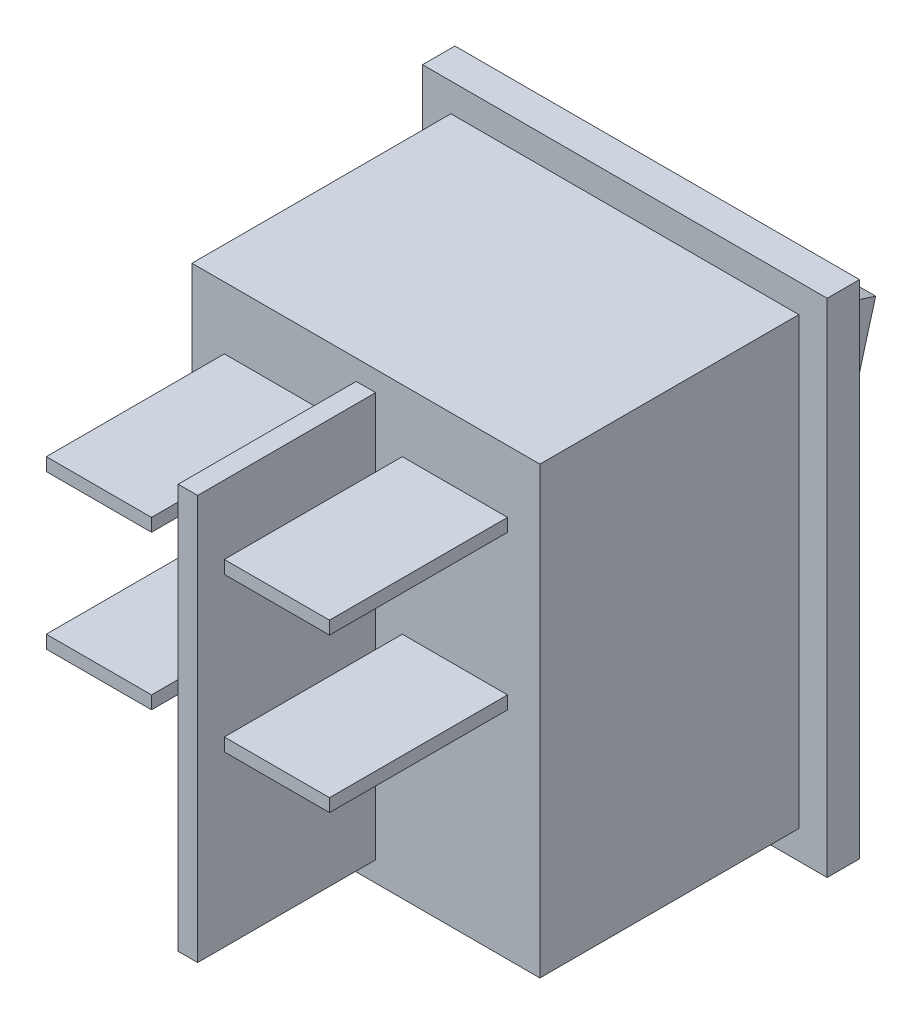
ISO-10303-21;
HEADER;
FILE_DESCRIPTION(('STEP AP214'),'2;1');
FILE_NAME('part.step','',(''),(''),'','','');
FILE_SCHEMA(('AUTOMOTIVE_DESIGN { 1 0 10303 214 1 1 1 1 }'));
ENDSEC;
DATA;
#1=APPLICATION_CONTEXT('core data for automotive mechanical design processes');
#2=APPLICATION_PROTOCOL_DEFINITION('international standard','automotive_design',2000,#1);
#3=PRODUCT_CONTEXT('',#1,'mechanical');
#4=PRODUCT('Part','Part','',(#3));
#5=PRODUCT_RELATED_PRODUCT_CATEGORY('part','',(#4));
#6=PRODUCT_DEFINITION_FORMATION('','',#4);
#7=PRODUCT_DEFINITION_CONTEXT('part definition',#1,'design');
#8=PRODUCT_DEFINITION('design','',#6,#7);
#9=PRODUCT_DEFINITION_SHAPE('','',#8);
#10=(LENGTH_UNIT() NAMED_UNIT(*) SI_UNIT(.MILLI.,.METRE.));
#11=(NAMED_UNIT(*) PLANE_ANGLE_UNIT() SI_UNIT($,.RADIAN.));
#12=(NAMED_UNIT(*) SI_UNIT($,.STERADIAN.) SOLID_ANGLE_UNIT());
#13=UNCERTAINTY_MEASURE_WITH_UNIT(LENGTH_MEASURE(1.E-05),#10,'distance_accuracy_value','');
#14=(GEOMETRIC_REPRESENTATION_CONTEXT(3) GLOBAL_UNCERTAINTY_ASSIGNED_CONTEXT((#13)) GLOBAL_UNIT_ASSIGNED_CONTEXT((#10,
#11,#12)) REPRESENTATION_CONTEXT('',''));
#15=CARTESIAN_POINT('',(0.,0.,0.));
#16=DIRECTION('',(0.,0.,1.));
#17=DIRECTION('',(1.,0.,0.));
#18=AXIS2_PLACEMENT_3D('',#15,#16,#17);
#19=CARTESIAN_POINT('',(-10.75,-13.75,29.));
#20=DIRECTION('',(1.,0.,0.));
#21=DIRECTION('',(0.,1.,0.));
#22=AXIS2_PLACEMENT_3D('',#19,#20,#21);
#23=PLANE('',#22);
#24=DIRECTION('',(0.,1.,0.));
#25=VECTOR('',#24,1.);
#26=CARTESIAN_POINT('',(-10.75,13.75,18.));
#27=LINE('',#26,#25);
#28=CARTESIAN_POINT('',(-10.75,-13.75,18.));
#29=VERTEX_POINT('',#28);
#30=CARTESIAN_POINT('',(-10.75,13.75,18.));
#31=VERTEX_POINT('',#30);
#32=EDGE_CURVE('E570',#29,#31,#27,.T.);
#33=ORIENTED_EDGE('',*,*,#32,.T.);
#34=DIRECTION('',(0.,0.,-1.));
#35=VECTOR('',#34,1.);
#36=CARTESIAN_POINT('',(-10.75,13.75,29.));
#37=LINE('',#36,#35);
#38=CARTESIAN_POINT('',(-10.75,13.75,2.));
#39=VERTEX_POINT('',#38);
#40=EDGE_CURVE('E486',#31,#39,#37,.T.);
#41=ORIENTED_EDGE('',*,*,#40,.T.);
#42=DIRECTION('',(0.,-1.,0.));
#43=VECTOR('',#42,1.);
#44=CARTESIAN_POINT('',(-10.75,-13.75,2.));
#45=LINE('',#44,#43);
#46=CARTESIAN_POINT('',(-10.75,-13.75,2.));
#47=VERTEX_POINT('',#46);
#48=EDGE_CURVE('E497',#39,#47,#45,.T.);
#49=ORIENTED_EDGE('',*,*,#48,.T.);
#50=DIRECTION('',(0.,0.,-1.));
#51=VECTOR('',#50,1.);
#52=CARTESIAN_POINT('',(-10.75,-13.75,29.));
#53=LINE('',#52,#51);
#54=EDGE_CURVE('E479',#29,#47,#53,.T.);
#55=ORIENTED_EDGE('',*,*,#54,.F.);
#56=EDGE_LOOP('',(#33,#41,#49,#55));
#57=FACE_BOUND('',#56,.T.);
#58=ADVANCED_FACE('F36',(#57),#23,.F.);
#59=CARTESIAN_POINT('',(10.75,-13.75,29.));
#60=DIRECTION('',(0.,1.,0.));
#61=DIRECTION('',(-1.,0.,0.));
#62=AXIS2_PLACEMENT_3D('',#59,#60,#61);
#63=PLANE('',#62);
#64=DIRECTION('',(-1.,0.,0.));
#65=VECTOR('',#64,1.);
#66=CARTESIAN_POINT('',(-10.75,-13.75,18.));
#67=LINE('',#66,#65);
#68=CARTESIAN_POINT('',(10.75,-13.75,18.));
#69=VERTEX_POINT('',#68);
#70=EDGE_CURVE('E573',#69,#29,#67,.T.);
#71=ORIENTED_EDGE('',*,*,#70,.T.);
#72=ORIENTED_EDGE('',*,*,#54,.T.);
#73=DIRECTION('',(1.,0.,0.));
#74=VECTOR('',#73,1.);
#75=CARTESIAN_POINT('',(10.75,-13.75,2.));
#76=LINE('',#75,#74);
#77=CARTESIAN_POINT('',(10.75,-13.75,2.));
#78=VERTEX_POINT('',#77);
#79=EDGE_CURVE('E494',#47,#78,#76,.T.);
#80=ORIENTED_EDGE('',*,*,#79,.T.);
#81=DIRECTION('',(0.,0.,-1.));
#82=VECTOR('',#81,1.);
#83=CARTESIAN_POINT('',(10.75,-13.75,29.));
#84=LINE('',#83,#82);
#85=EDGE_CURVE('E480',#69,#78,#84,.T.);
#86=ORIENTED_EDGE('',*,*,#85,.F.);
#87=EDGE_LOOP('',(#71,#72,#80,#86));
#88=FACE_BOUND('',#87,.T.);
#89=ADVANCED_FACE('F414',(#88),#63,.F.);
#90=CARTESIAN_POINT('',(10.75,13.75,29.));
#91=DIRECTION('',(-1.,0.,0.));
#92=DIRECTION('',(0.,-1.,0.));
#93=AXIS2_PLACEMENT_3D('',#90,#91,#92);
#94=PLANE('',#93);
#95=DIRECTION('',(0.,-1.,0.));
#96=VECTOR('',#95,1.);
#97=CARTESIAN_POINT('',(10.75,-13.75,18.));
#98=LINE('',#97,#96);
#99=CARTESIAN_POINT('',(10.75,13.75,18.));
#100=VERTEX_POINT('',#99);
#101=EDGE_CURVE('E51',#100,#69,#98,.T.);
#102=ORIENTED_EDGE('',*,*,#101,.T.);
#103=ORIENTED_EDGE('',*,*,#85,.T.);
#104=DIRECTION('',(0.,1.,0.));
#105=VECTOR('',#104,1.);
#106=CARTESIAN_POINT('',(10.75,13.75,2.));
#107=LINE('',#106,#105);
#108=CARTESIAN_POINT('',(10.75,13.75,2.));
#109=VERTEX_POINT('',#108);
#110=EDGE_CURVE('E491',#78,#109,#107,.T.);
#111=ORIENTED_EDGE('',*,*,#110,.T.);
#112=DIRECTION('',(0.,0.,-1.));
#113=VECTOR('',#112,1.);
#114=CARTESIAN_POINT('',(10.75,13.75,29.));
#115=LINE('',#114,#113);
#116=EDGE_CURVE('E484',#100,#109,#115,.T.);
#117=ORIENTED_EDGE('',*,*,#116,.F.);
#118=EDGE_LOOP('',(#102,#103,#111,#117));
#119=FACE_BOUND('',#118,.T.);
#120=ADVANCED_FACE('F410',(#119),#94,.F.);
#121=CARTESIAN_POINT('',(-10.75,13.75,29.));
#122=DIRECTION('',(0.,-1.,0.));
#123=DIRECTION('',(1.,0.,0.));
#124=AXIS2_PLACEMENT_3D('',#121,#122,#123);
#125=PLANE('',#124);
#126=DIRECTION('',(1.,0.,0.));
#127=VECTOR('',#126,1.);
#128=CARTESIAN_POINT('',(10.75,13.75,18.));
#129=LINE('',#128,#127);
#130=EDGE_CURVE('E551',#31,#100,#129,.T.);
#131=ORIENTED_EDGE('',*,*,#130,.T.);
#132=ORIENTED_EDGE('',*,*,#116,.T.);
#133=DIRECTION('',(-1.,0.,0.));
#134=VECTOR('',#133,1.);
#135=CARTESIAN_POINT('',(-10.75,13.75,2.));
#136=LINE('',#135,#134);
#137=EDGE_CURVE('E488',#109,#39,#136,.T.);
#138=ORIENTED_EDGE('',*,*,#137,.T.);
#139=ORIENTED_EDGE('',*,*,#40,.F.);
#140=EDGE_LOOP('',(#131,#132,#138,#139));
#141=FACE_BOUND('',#140,.T.);
#142=ADVANCED_FACE('F401',(#141),#125,.F.);
#143=CARTESIAN_POINT('',(9.5,12.,-4.));
#144=DIRECTION('',(-1.,0.,0.));
#145=DIRECTION('',(0.,-1.,0.));
#146=AXIS2_PLACEMENT_3D('',#143,#144,#145);
#147=PLANE('',#146);
#148=CARTESIAN_POINT('',(9.49999999999999,-12.,-0.395606649697375));
#149=CARTESIAN_POINT('',(9.49999999999999,-10.9388077344968,-0.407203251131328));
#150=CARTESIAN_POINT('',(9.49999999999999,-6.47035707461225,-0.456034026679239));
#151=CARTESIAN_POINT('',(9.49999999999999,1.36130253862841,-1.24450158928353));
#152=CARTESIAN_POINT('',(9.49999999999999,7.87953286006794,-3.08623094062161));
#153=CARTESIAN_POINT('',(9.49999999999999,11.1135352857263,-4.));
#154=B_SPLINE_CURVE_WITH_KNOTS('',3,(#148,#149,#150,#151,#152,#153),.UNSPECIFIED.,.F.,.F.,(4,1,
1,4),(0.,0.13563985663774,0.571150041893795,1.),.UNSPECIFIED.);
#155=CARTESIAN_POINT('',(9.5,11.1135352857263,-4.));
#156=VERTEX_POINT('',#155);
#157=CARTESIAN_POINT('',(9.49999999999999,-12.,-0.395606649697375));
#158=VERTEX_POINT('',#157);
#159=EDGE_CURVE('E516',#156,#158,#154,.F.);
#160=ORIENTED_EDGE('',*,*,#159,.F.);
#161=CARTESIAN_POINT('',(9.49999999999999,11.1135352857263,-4.));
#162=CARTESIAN_POINT('',(9.49999999999999,11.3839608449453,-3.18935338669517));
#163=CARTESIAN_POINT('',(9.49999999999999,11.8193065458659,-1.88433059562738));
#164=CARTESIAN_POINT('',(9.49999999999999,11.9503553460077,-0.517710732108176));
#165=CARTESIAN_POINT('',(9.49999999999999,12.,0.));
#166=B_SPLINE_CURVE_WITH_KNOTS('',3,(#161,#162,#163,#164,#165),.UNSPECIFIED.,.F.,.F.,(4,1,4),
(0.,0.621174295846243,1.),.UNSPECIFIED.);
#167=CARTESIAN_POINT('',(9.49999999999999,12.,0.));
#168=VERTEX_POINT('',#167);
#169=EDGE_CURVE('E529',#168,#156,#166,.F.);
#170=ORIENTED_EDGE('',*,*,#169,.F.);
#171=DIRECTION('',(0.,-1.,0.));
#172=VECTOR('',#171,1.);
#173=CARTESIAN_POINT('',(9.5,12.,0.));
#174=LINE('',#173,#172);
#175=CARTESIAN_POINT('',(9.49999999999999,-12.,0.));
#176=VERTEX_POINT('',#175);
#177=EDGE_CURVE('E513',#168,#176,#174,.T.);
#178=ORIENTED_EDGE('',*,*,#177,.T.);
#179=DIRECTION('',(0.,0.,1.));
#180=VECTOR('',#179,1.);
#181=CARTESIAN_POINT('',(9.49999999999999,-12.,-4.));
#182=LINE('',#181,#180);
#183=EDGE_CURVE('E500',#158,#176,#182,.T.);
#184=ORIENTED_EDGE('',*,*,#183,.F.);
#185=EDGE_LOOP('',(#160,#170,#178,#184));
#186=FACE_BOUND('',#185,.T.);
#187=ADVANCED_FACE('F397',(#186),#147,.F.);
#188=CARTESIAN_POINT('',(9.49999999999999,-12.,-4.));
#189=DIRECTION('',(0.,1.,0.));
#190=DIRECTION('',(-1.,0.,0.));
#191=AXIS2_PLACEMENT_3D('',#188,#189,#190);
#192=PLANE('',#191);
#193=DIRECTION('',(1.,0.,0.));
#194=VECTOR('',#193,1.);
#195=CARTESIAN_POINT('',(-77.9005027049288,-12.,-0.395606649697375));
#196=LINE('',#195,#194);
#197=CARTESIAN_POINT('',(-9.5,-12.,-0.395606649697375));
#198=VERTEX_POINT('',#197);
#199=EDGE_CURVE('E545',#198,#158,#196,.T.);
#200=ORIENTED_EDGE('',*,*,#199,.T.);
#201=ORIENTED_EDGE('',*,*,#183,.T.);
#202=DIRECTION('',(-1.,0.,0.));
#203=VECTOR('',#202,1.);
#204=CARTESIAN_POINT('',(9.49999999999999,-12.,0.));
#205=LINE('',#204,#203);
#206=CARTESIAN_POINT('',(-9.5,-12.,0.));
#207=VERTEX_POINT('',#206);
#208=EDGE_CURVE('E510',#176,#207,#205,.T.);
#209=ORIENTED_EDGE('',*,*,#208,.T.);
#210=DIRECTION('',(0.,0.,1.));
#211=VECTOR('',#210,1.);
#212=CARTESIAN_POINT('',(-9.5,-12.,-4.));
#213=LINE('',#212,#211);
#214=EDGE_CURVE('E502',#198,#207,#213,.T.);
#215=ORIENTED_EDGE('',*,*,#214,.F.);
#216=EDGE_LOOP('',(#200,#201,#209,#215));
#217=FACE_BOUND('',#216,.T.);
#218=ADVANCED_FACE('F393',(#217),#192,.F.);
#219=CARTESIAN_POINT('',(-9.5,12.,-4.));
#220=DIRECTION('',(1.,0.,0.));
#221=DIRECTION('',(0.,1.,0.));
#222=AXIS2_PLACEMENT_3D('',#219,#220,#221);
#223=PLANE('',#222);
#224=CARTESIAN_POINT('',(-9.49999999999999,-12.,-0.395606649697375));
#225=CARTESIAN_POINT('',(-9.49999999999999,-10.9388077344968,-0.407203251131328));
#226=CARTESIAN_POINT('',(-9.49999999999999,-6.47035707461225,-0.456034026679239));
#227=CARTESIAN_POINT('',(-9.49999999999999,1.36130253862842,-1.24450158928353));
#228=CARTESIAN_POINT('',(-9.49999999999999,7.87953286006794,-3.08623094062161));
#229=CARTESIAN_POINT('',(-9.49999999999999,11.1135352857263,-4.));
#230=B_SPLINE_CURVE_WITH_KNOTS('',3,(#224,#225,#226,#227,#228,#229),.UNSPECIFIED.,.F.,.F.,(4,1,
1,4),(0.,0.13563985663774,0.571150041893795,1.),.UNSPECIFIED.);
#231=CARTESIAN_POINT('',(-9.5,11.1135352857263,-4.));
#232=VERTEX_POINT('',#231);
#233=EDGE_CURVE('E521',#198,#232,#230,.T.);
#234=ORIENTED_EDGE('',*,*,#233,.F.);
#235=ORIENTED_EDGE('',*,*,#214,.T.);
#236=DIRECTION('',(0.,1.,0.));
#237=VECTOR('',#236,1.);
#238=CARTESIAN_POINT('',(-9.5,12.,0.));
#239=LINE('',#238,#237);
#240=CARTESIAN_POINT('',(-9.5,12.,0.));
#241=VERTEX_POINT('',#240);
#242=EDGE_CURVE('E507',#207,#241,#239,.T.);
#243=ORIENTED_EDGE('',*,*,#242,.T.);
#244=CARTESIAN_POINT('',(-9.49999999999999,11.1135352857263,-4.));
#245=CARTESIAN_POINT('',(-9.49999999999999,11.3839608449453,-3.18935338669517));
#246=CARTESIAN_POINT('',(-9.49999999999999,11.8193065458659,-1.88433059562738));
#247=CARTESIAN_POINT('',(-9.49999999999999,11.9503553460077,-0.517710732108176));
#248=CARTESIAN_POINT('',(-9.49999999999999,12.,0.));
#249=B_SPLINE_CURVE_WITH_KNOTS('',3,(#244,#245,#246,#247,#248),.UNSPECIFIED.,.F.,.F.,(4,1,4),
(0.,0.621174295846243,1.),.UNSPECIFIED.);
#250=EDGE_CURVE('E537',#232,#241,#249,.T.);
#251=ORIENTED_EDGE('',*,*,#250,.F.);
#252=EDGE_LOOP('',(#234,#235,#243,#251));
#253=FACE_BOUND('',#252,.T.);
#254=ADVANCED_FACE('F389',(#253),#223,.F.);
#255=CARTESIAN_POINT('',(-12.5,-15.5,0.));
#256=DIRECTION('',(0.,0.,1.));
#257=DIRECTION('',(1.,0.,0.));
#258=AXIS2_PLACEMENT_3D('',#255,#256,#257);
#259=PLANE('',#258);
#260=ORIENTED_EDGE('',*,*,#177,.F.);
#261=DIRECTION('',(1.,0.,0.));
#262=VECTOR('',#261,1.);
#263=CARTESIAN_POINT('',(9.5,12.,0.));
#264=LINE('',#263,#262);
#265=EDGE_CURVE('E504',#241,#168,#264,.T.);
#266=ORIENTED_EDGE('',*,*,#265,.F.);
#267=ORIENTED_EDGE('',*,*,#242,.F.);
#268=ORIENTED_EDGE('',*,*,#208,.F.);
#269=EDGE_LOOP('',(#260,#266,#267,#268));
#270=FACE_BOUND('',#269,.T.);
#271=DIRECTION('',(-1.,0.,0.));
#272=VECTOR('',#271,1.);
#273=CARTESIAN_POINT('',(-12.5,15.5,0.));
#274=LINE('',#273,#272);
#275=CARTESIAN_POINT('',(12.5,15.5,0.));
#276=VERTEX_POINT('',#275);
#277=CARTESIAN_POINT('',(-12.5,15.5,0.));
#278=VERTEX_POINT('',#277);
#279=EDGE_CURVE('E459',#276,#278,#274,.T.);
#280=ORIENTED_EDGE('',*,*,#279,.F.);
#281=DIRECTION('',(0.,1.,0.));
#282=VECTOR('',#281,1.);
#283=CARTESIAN_POINT('',(12.5,15.5,0.));
#284=LINE('',#283,#282);
#285=CARTESIAN_POINT('',(12.5,-15.5,0.));
#286=VERTEX_POINT('',#285);
#287=EDGE_CURVE('E451',#286,#276,#284,.T.);
#288=ORIENTED_EDGE('',*,*,#287,.F.);
#289=DIRECTION('',(1.,0.,0.));
#290=VECTOR('',#289,1.);
#291=CARTESIAN_POINT('',(12.5,-15.5,0.));
#292=LINE('',#291,#290);
#293=CARTESIAN_POINT('',(-12.5,-15.5,0.));
#294=VERTEX_POINT('',#293);
#295=EDGE_CURVE('E444',#294,#286,#292,.T.);
#296=ORIENTED_EDGE('',*,*,#295,.F.);
#297=DIRECTION('',(0.,-1.,0.));
#298=VECTOR('',#297,1.);
#299=CARTESIAN_POINT('',(-12.5,-15.5,0.));
#300=LINE('',#299,#298);
#301=EDGE_CURVE('E452',#278,#294,#300,.T.);
#302=ORIENTED_EDGE('',*,*,#301,.F.);
#303=EDGE_LOOP('',(#280,#288,#296,#302));
#304=FACE_BOUND('',#303,.T.);
#305=ADVANCED_FACE('F392',(#270,#304),#259,.F.);
#306=CARTESIAN_POINT('',(-12.5,-15.5,2.));
#307=DIRECTION('',(0.,0.,1.));
#308=DIRECTION('',(1.,0.,0.));
#309=AXIS2_PLACEMENT_3D('',#306,#307,#308);
#310=PLANE('',#309);
#311=DIRECTION('',(0.,-1.,0.));
#312=VECTOR('',#311,1.);
#313=CARTESIAN_POINT('',(-12.5,-15.5,2.));
#314=LINE('',#313,#312);
#315=CARTESIAN_POINT('',(-12.5,15.5,2.));
#316=VERTEX_POINT('',#315);
#317=CARTESIAN_POINT('',(-12.5,-15.5,2.));
#318=VERTEX_POINT('',#317);
#319=EDGE_CURVE('E461',#316,#318,#314,.T.);
#320=ORIENTED_EDGE('',*,*,#319,.T.);
#321=DIRECTION('',(1.,0.,0.));
#322=VECTOR('',#321,1.);
#323=CARTESIAN_POINT('',(12.5,-15.5,2.));
#324=LINE('',#323,#322);
#325=CARTESIAN_POINT('',(12.5,-15.5,2.));
#326=VERTEX_POINT('',#325);
#327=EDGE_CURVE('E467',#318,#326,#324,.T.);
#328=ORIENTED_EDGE('',*,*,#327,.T.);
#329=DIRECTION('',(0.,1.,0.));
#330=VECTOR('',#329,1.);
#331=CARTESIAN_POINT('',(12.5,15.5,2.));
#332=LINE('',#331,#330);
#333=CARTESIAN_POINT('',(12.5,15.5,2.));
#334=VERTEX_POINT('',#333);
#335=EDGE_CURVE('E456',#326,#334,#332,.T.);
#336=ORIENTED_EDGE('',*,*,#335,.T.);
#337=DIRECTION('',(-1.,0.,0.));
#338=VECTOR('',#337,1.);
#339=CARTESIAN_POINT('',(-12.5,15.5,2.));
#340=LINE('',#339,#338);
#341=EDGE_CURVE('E470',#334,#316,#340,.T.);
#342=ORIENTED_EDGE('',*,*,#341,.T.);
#343=EDGE_LOOP('',(#320,#328,#336,#342));
#344=FACE_BOUND('',#343,.T.);
#345=ORIENTED_EDGE('',*,*,#79,.F.);
#346=ORIENTED_EDGE('',*,*,#48,.F.);
#347=ORIENTED_EDGE('',*,*,#137,.F.);
#348=ORIENTED_EDGE('',*,*,#110,.F.);
#349=EDGE_LOOP('',(#345,#346,#347,#348));
#350=FACE_BOUND('',#349,.T.);
#351=ADVANCED_FACE('F424',(#344,#350),#310,.T.);
#352=CARTESIAN_POINT('',(-12.5,-15.5,2.));
#353=DIRECTION('',(1.,0.,0.));
#354=DIRECTION('',(0.,1.,0.));
#355=AXIS2_PLACEMENT_3D('',#352,#353,#354);
#356=PLANE('',#355);
#357=ORIENTED_EDGE('',*,*,#301,.T.);
#358=DIRECTION('',(0.,0.,-1.));
#359=VECTOR('',#358,1.);
#360=CARTESIAN_POINT('',(-12.5,-15.5,2.));
#361=LINE('',#360,#359);
#362=EDGE_CURVE('E13',#318,#294,#361,.T.);
#363=ORIENTED_EDGE('',*,*,#362,.F.);
#364=ORIENTED_EDGE('',*,*,#319,.F.);
#365=DIRECTION('',(0.,0.,-1.));
#366=VECTOR('',#365,1.);
#367=CARTESIAN_POINT('',(-12.5,15.5,2.));
#368=LINE('',#367,#366);
#369=EDGE_CURVE('E472',#316,#278,#368,.T.);
#370=ORIENTED_EDGE('',*,*,#369,.T.);
#371=EDGE_LOOP('',(#357,#363,#364,#370));
#372=FACE_BOUND('',#371,.T.);
#373=ADVANCED_FACE('F38',(#372),#356,.F.);
#374=CARTESIAN_POINT('',(12.5,-15.5,2.));
#375=DIRECTION('',(0.,1.,0.));
#376=DIRECTION('',(-1.,0.,0.));
#377=AXIS2_PLACEMENT_3D('',#374,#375,#376);
#378=PLANE('',#377);
#379=ORIENTED_EDGE('',*,*,#295,.T.);
#380=DIRECTION('',(0.,0.,-1.));
#381=VECTOR('',#380,1.);
#382=CARTESIAN_POINT('',(12.5,-15.5,2.));
#383=LINE('',#382,#381);
#384=EDGE_CURVE('E44',#326,#286,#383,.T.);
#385=ORIENTED_EDGE('',*,*,#384,.F.);
#386=ORIENTED_EDGE('',*,*,#327,.F.);
#387=ORIENTED_EDGE('',*,*,#362,.T.);
#388=EDGE_LOOP('',(#379,#385,#386,#387));
#389=FACE_BOUND('',#388,.T.);
#390=ADVANCED_FACE('F434',(#389),#378,.F.);
#391=CARTESIAN_POINT('',(12.5,15.5,2.));
#392=DIRECTION('',(-1.,0.,0.));
#393=DIRECTION('',(0.,-1.,0.));
#394=AXIS2_PLACEMENT_3D('',#391,#392,#393);
#395=PLANE('',#394);
#396=ORIENTED_EDGE('',*,*,#287,.T.);
#397=DIRECTION('',(0.,0.,-1.));
#398=VECTOR('',#397,1.);
#399=CARTESIAN_POINT('',(12.5,15.5,2.));
#400=LINE('',#399,#398);
#401=EDGE_CURVE('E457',#334,#276,#400,.T.);
#402=ORIENTED_EDGE('',*,*,#401,.F.);
#403=ORIENTED_EDGE('',*,*,#335,.F.);
#404=ORIENTED_EDGE('',*,*,#384,.T.);
#405=EDGE_LOOP('',(#396,#402,#403,#404));
#406=FACE_BOUND('',#405,.T.);
#407=ADVANCED_FACE('F431',(#406),#395,.F.);
#408=CARTESIAN_POINT('',(-12.5,15.5,2.));
#409=DIRECTION('',(0.,-1.,0.));
#410=DIRECTION('',(1.,0.,0.));
#411=AXIS2_PLACEMENT_3D('',#408,#409,#410);
#412=PLANE('',#411);
#413=ORIENTED_EDGE('',*,*,#279,.T.);
#414=ORIENTED_EDGE('',*,*,#369,.F.);
#415=ORIENTED_EDGE('',*,*,#341,.F.);
#416=ORIENTED_EDGE('',*,*,#401,.T.);
#417=EDGE_LOOP('',(#413,#414,#415,#416));
#418=FACE_BOUND('',#417,.T.);
#419=ADVANCED_FACE('F387',(#418),#412,.F.);
#420=CARTESIAN_POINT('',(-77.9005027049288,-12.,-0.395606649697375));
#421=CARTESIAN_POINT('',(-77.9005027049288,-10.9388077344967,-0.407203251131328));
#422=CARTESIAN_POINT('',(-77.9005027049288,-6.47035707461224,-0.456034026679239));
#423=CARTESIAN_POINT('',(-77.9005027049288,1.36130253862842,-1.24450158928353));
#424=CARTESIAN_POINT('',(-77.9005027049288,7.87953286006795,-3.08623094062161));
#425=CARTESIAN_POINT('',(-77.9005027049288,11.1135352857263,-4.));
#426=B_SPLINE_CURVE_WITH_KNOTS('',3,(#420,#421,#422,#423,#424,#425),.UNSPECIFIED.,.F.,.F.,(4,1,
1,4),(0.,0.13563985663774,0.571150041893795,1.),.UNSPECIFIED.);
#427=DIRECTION('',(1.,0.,0.));
#428=VECTOR('',#427,1.);
#429=SURFACE_OF_LINEAR_EXTRUSION('',#426,#428);
#430=DIRECTION('',(1.,0.,0.));
#431=VECTOR('',#430,1.);
#432=CARTESIAN_POINT('',(-77.9005027049288,11.1135352857263,-4.));
#433=LINE('',#432,#431);
#434=EDGE_CURVE('E546',#232,#156,#433,.T.);
#435=ORIENTED_EDGE('',*,*,#434,.T.);
#436=ORIENTED_EDGE('',*,*,#159,.T.);
#437=ORIENTED_EDGE('',*,*,#199,.F.);
#438=ORIENTED_EDGE('',*,*,#233,.T.);
#439=EDGE_LOOP('',(#435,#436,#437,#438));
#440=FACE_BOUND('',#439,.T.);
#441=ADVANCED_FACE('F381',(#440),#429,.T.);
#442=CARTESIAN_POINT('',(-77.9005027049288,11.1135352857263,-4.));
#443=CARTESIAN_POINT('',(-77.9005027049288,11.3839608449453,-3.18935338669517));
#444=CARTESIAN_POINT('',(-77.9005027049288,11.8193065458659,-1.88433059562738));
#445=CARTESIAN_POINT('',(-77.9005027049288,11.9503553460078,-0.517710732108176));
#446=CARTESIAN_POINT('',(-77.9005027049288,12.,0.));
#447=B_SPLINE_CURVE_WITH_KNOTS('',3,(#442,#443,#444,#445,#446),.UNSPECIFIED.,.F.,.F.,(4,1,4),
(0.,0.621174295846243,1.),.UNSPECIFIED.);
#448=DIRECTION('',(1.,0.,0.));
#449=VECTOR('',#448,1.);
#450=SURFACE_OF_LINEAR_EXTRUSION('',#447,#449);
#451=ORIENTED_EDGE('',*,*,#265,.T.);
#452=ORIENTED_EDGE('',*,*,#169,.T.);
#453=ORIENTED_EDGE('',*,*,#434,.F.);
#454=ORIENTED_EDGE('',*,*,#250,.T.);
#455=EDGE_LOOP('',(#451,#452,#453,#454));
#456=FACE_BOUND('',#455,.T.);
#457=ADVANCED_FACE('F376',(#456),#450,.T.);
#458=CARTESIAN_POINT('',(-0.600000000000008,-12.5,-32.9070193514141));
#459=DIRECTION('',(0.,-1.,0.));
#460=DIRECTION('',(0.,0.,-1.));
#461=AXIS2_PLACEMENT_3D('',#458,#459,#460);
#462=PLANE('',#461);
#463=DIRECTION('',(0.,0.,1.));
#464=VECTOR('',#463,1.);
#465=CARTESIAN_POINT('',(0.600000000000004,-12.5,-32.9070193514141));
#466=LINE('',#465,#464);
#467=CARTESIAN_POINT('',(0.600000000000004,-12.5,18.));
#468=VERTEX_POINT('',#467);
#469=CARTESIAN_POINT('',(0.600000000000004,-12.5,29.));
#470=VERTEX_POINT('',#469);
#471=EDGE_CURVE('E359',#468,#470,#466,.T.);
#472=ORIENTED_EDGE('',*,*,#471,.T.);
#473=DIRECTION('',(1.,0.,0.));
#474=VECTOR('',#473,1.);
#475=CARTESIAN_POINT('',(-0.600000000000008,-12.5,29.));
#476=LINE('',#475,#474);
#477=CARTESIAN_POINT('',(-0.600000000000008,-12.5,29.));
#478=VERTEX_POINT('',#477);
#479=EDGE_CURVE('E59',#478,#470,#476,.T.);
#480=ORIENTED_EDGE('',*,*,#479,.F.);
#481=DIRECTION('',(0.,0.,1.));
#482=VECTOR('',#481,1.);
#483=CARTESIAN_POINT('',(-0.600000000000008,-12.5,-32.9070193514141));
#484=LINE('',#483,#482);
#485=CARTESIAN_POINT('',(-0.600000000000008,-12.5,18.));
#486=VERTEX_POINT('',#485);
#487=EDGE_CURVE('E354',#486,#478,#484,.T.);
#488=ORIENTED_EDGE('',*,*,#487,.F.);
#489=DIRECTION('',(-1.,0.,0.));
#490=VECTOR('',#489,1.);
#491=CARTESIAN_POINT('',(-0.600000000000008,-12.5,18.));
#492=LINE('',#491,#490);
#493=EDGE_CURVE('E574',#468,#486,#492,.T.);
#494=ORIENTED_EDGE('',*,*,#493,.F.);
#495=EDGE_LOOP('',(#472,#480,#488,#494));
#496=FACE_BOUND('',#495,.T.);
#497=ADVANCED_FACE('F380',(#496),#462,.T.);
#498=CARTESIAN_POINT('',(0.6,12.5,-32.9070193514141));
#499=DIRECTION('',(1.,0.,0.));
#500=DIRECTION('',(0.,1.,0.));
#501=AXIS2_PLACEMENT_3D('',#498,#499,#500);
#502=PLANE('',#501);
#503=DIRECTION('',(0.,0.,1.));
#504=VECTOR('',#503,1.);
#505=CARTESIAN_POINT('',(0.6,12.5,-32.9070193514141));
#506=LINE('',#505,#504);
#507=CARTESIAN_POINT('',(0.6,12.5,18.));
#508=VERTEX_POINT('',#507);
#509=CARTESIAN_POINT('',(0.6,12.5,29.));
#510=VERTEX_POINT('',#509);
#511=EDGE_CURVE('E357',#508,#510,#506,.T.);
#512=ORIENTED_EDGE('',*,*,#511,.T.);
#513=DIRECTION('',(0.,1.,0.));
#514=VECTOR('',#513,1.);
#515=CARTESIAN_POINT('',(0.6,12.5,29.));
#516=LINE('',#515,#514);
#517=EDGE_CURVE('E348',#470,#510,#516,.T.);
#518=ORIENTED_EDGE('',*,*,#517,.F.);
#519=ORIENTED_EDGE('',*,*,#471,.F.);
#520=DIRECTION('',(0.,-1.,0.));
#521=VECTOR('',#520,1.);
#522=CARTESIAN_POINT('',(0.6,12.5,18.));
#523=LINE('',#522,#521);
#524=EDGE_CURVE('E559',#508,#468,#523,.T.);
#525=ORIENTED_EDGE('',*,*,#524,.F.);
#526=EDGE_LOOP('',(#512,#518,#519,#525));
#527=FACE_BOUND('',#526,.T.);
#528=ADVANCED_FACE('F634',(#527),#502,.T.);
#529=CARTESIAN_POINT('',(-0.599999999999998,12.5,-32.9070193514141));
#530=DIRECTION('',(0.,1.,0.));
#531=DIRECTION('',(0.,0.,1.));
#532=AXIS2_PLACEMENT_3D('',#529,#530,#531);
#533=PLANE('',#532);
#534=DIRECTION('',(0.,0.,1.));
#535=VECTOR('',#534,1.);
#536=CARTESIAN_POINT('',(-0.599999999999998,12.5,-32.9070193514141));
#537=LINE('',#536,#535);
#538=CARTESIAN_POINT('',(-0.599999999999998,12.5,18.));
#539=VERTEX_POINT('',#538);
#540=CARTESIAN_POINT('',(-0.599999999999998,12.5,29.));
#541=VERTEX_POINT('',#540);
#542=EDGE_CURVE('E355',#539,#541,#537,.T.);
#543=ORIENTED_EDGE('',*,*,#542,.T.);
#544=DIRECTION('',(-1.,0.,0.));
#545=VECTOR('',#544,1.);
#546=CARTESIAN_POINT('',(-0.599999999999998,12.5,29.));
#547=LINE('',#546,#545);
#548=EDGE_CURVE('E351',#510,#541,#547,.T.);
#549=ORIENTED_EDGE('',*,*,#548,.F.);
#550=ORIENTED_EDGE('',*,*,#511,.F.);
#551=DIRECTION('',(1.,0.,0.));
#552=VECTOR('',#551,1.);
#553=CARTESIAN_POINT('',(-0.599999999999998,12.5,18.));
#554=LINE('',#553,#552);
#555=EDGE_CURVE('E564',#539,#508,#554,.T.);
#556=ORIENTED_EDGE('',*,*,#555,.F.);
#557=EDGE_LOOP('',(#543,#549,#550,#556));
#558=FACE_BOUND('',#557,.T.);
#559=ADVANCED_FACE('F637',(#558),#533,.T.);
#560=CARTESIAN_POINT('',(-0.599999999999998,12.5,-32.9070193514141));
#561=DIRECTION('',(-1.,0.,0.));
#562=DIRECTION('',(0.,-1.,0.));
#563=AXIS2_PLACEMENT_3D('',#560,#561,#562);
#564=PLANE('',#563);
#565=ORIENTED_EDGE('',*,*,#487,.T.);
#566=DIRECTION('',(0.,-1.,0.));
#567=VECTOR('',#566,1.);
#568=CARTESIAN_POINT('',(-0.599999999999998,12.5,29.));
#569=LINE('',#568,#567);
#570=EDGE_CURVE('E338',#541,#478,#569,.T.);
#571=ORIENTED_EDGE('',*,*,#570,.F.);
#572=ORIENTED_EDGE('',*,*,#542,.F.);
#573=DIRECTION('',(0.,1.,0.));
#574=VECTOR('',#573,1.);
#575=CARTESIAN_POINT('',(-0.599999999999998,12.5,18.));
#576=LINE('',#575,#574);
#577=EDGE_CURVE('E568',#486,#539,#576,.T.);
#578=ORIENTED_EDGE('',*,*,#577,.F.);
#579=EDGE_LOOP('',(#565,#571,#572,#578));
#580=FACE_BOUND('',#579,.T.);
#581=ADVANCED_FACE('F383',(#580),#564,.T.);
#582=CARTESIAN_POINT('',(-8.75,9.1,-32.9070193514141));
#583=DIRECTION('',(0.,-1.,0.));
#584=DIRECTION('',(0.,0.,-1.));
#585=AXIS2_PLACEMENT_3D('',#582,#583,#584);
#586=PLANE('',#585);
#587=DIRECTION('',(0.,0.,1.));
#588=VECTOR('',#587,1.);
#589=CARTESIAN_POINT('',(-2.25,9.1,-32.9070193514141));
#590=LINE('',#589,#588);
#591=CARTESIAN_POINT('',(-2.25,9.1,18.));
#592=VERTEX_POINT('',#591);
#593=CARTESIAN_POINT('',(-2.25,9.1,29.));
#594=VERTEX_POINT('',#593);
#595=EDGE_CURVE('E341',#592,#594,#590,.T.);
#596=ORIENTED_EDGE('',*,*,#595,.T.);
#597=DIRECTION('',(1.,0.,0.));
#598=VECTOR('',#597,1.);
#599=CARTESIAN_POINT('',(-8.75,9.1,29.));
#600=LINE('',#599,#598);
#601=CARTESIAN_POINT('',(-8.75,9.1,29.));
#602=VERTEX_POINT('',#601);
#603=EDGE_CURVE('E326',#602,#594,#600,.T.);
#604=ORIENTED_EDGE('',*,*,#603,.F.);
#605=DIRECTION('',(0.,0.,1.));
#606=VECTOR('',#605,1.);
#607=CARTESIAN_POINT('',(-8.75,9.1,-32.9070193514141));
#608=LINE('',#607,#606);
#609=CARTESIAN_POINT('',(-8.75,9.1,18.));
#610=VERTEX_POINT('',#609);
#611=EDGE_CURVE('E335',#610,#602,#608,.T.);
#612=ORIENTED_EDGE('',*,*,#611,.F.);
#613=DIRECTION('',(-1.,0.,0.));
#614=VECTOR('',#613,1.);
#615=CARTESIAN_POINT('',(-8.75,9.1,18.));
#616=LINE('',#615,#614);
#617=EDGE_CURVE('E602',#592,#610,#616,.T.);
#618=ORIENTED_EDGE('',*,*,#617,.F.);
#619=EDGE_LOOP('',(#596,#604,#612,#618));
#620=FACE_BOUND('',#619,.T.);
#621=ADVANCED_FACE('F644',(#620),#586,.T.);
#622=CARTESIAN_POINT('',(-2.25,9.9,-32.9070193514141));
#623=DIRECTION('',(1.,0.,0.));
#624=DIRECTION('',(0.,0.,-1.));
#625=AXIS2_PLACEMENT_3D('',#622,#623,#624);
#626=PLANE('',#625);
#627=DIRECTION('',(0.,0.,1.));
#628=VECTOR('',#627,1.);
#629=CARTESIAN_POINT('',(-2.25,9.9,-32.9070193514141));
#630=LINE('',#629,#628);
#631=CARTESIAN_POINT('',(-2.25,9.9,18.));
#632=VERTEX_POINT('',#631);
#633=CARTESIAN_POINT('',(-2.25,9.9,29.));
#634=VERTEX_POINT('',#633);
#635=EDGE_CURVE('E339',#632,#634,#630,.T.);
#636=ORIENTED_EDGE('',*,*,#635,.T.);
#637=DIRECTION('',(0.,1.,0.));
#638=VECTOR('',#637,1.);
#639=CARTESIAN_POINT('',(-2.25,9.9,29.));
#640=LINE('',#639,#638);
#641=EDGE_CURVE('E329',#594,#634,#640,.T.);
#642=ORIENTED_EDGE('',*,*,#641,.F.);
#643=ORIENTED_EDGE('',*,*,#595,.F.);
#644=DIRECTION('',(0.,-1.,0.));
#645=VECTOR('',#644,1.);
#646=CARTESIAN_POINT('',(-2.25,9.9,18.));
#647=LINE('',#646,#645);
#648=EDGE_CURVE('E614',#632,#592,#647,.T.);
#649=ORIENTED_EDGE('',*,*,#648,.F.);
#650=EDGE_LOOP('',(#636,#642,#643,#649));
#651=FACE_BOUND('',#650,.T.);
#652=ADVANCED_FACE('F678',(#651),#626,.T.);
#653=CARTESIAN_POINT('',(-8.75,9.9,-32.9070193514141));
#654=DIRECTION('',(0.,1.,0.));
#655=DIRECTION('',(0.,0.,1.));
#656=AXIS2_PLACEMENT_3D('',#653,#654,#655);
#657=PLANE('',#656);
#658=DIRECTION('',(0.,0.,1.));
#659=VECTOR('',#658,1.);
#660=CARTESIAN_POINT('',(-8.75,9.9,-32.9070193514141));
#661=LINE('',#660,#659);
#662=CARTESIAN_POINT('',(-8.75,9.9,18.));
#663=VERTEX_POINT('',#662);
#664=CARTESIAN_POINT('',(-8.75,9.9,29.));
#665=VERTEX_POINT('',#664);
#666=EDGE_CURVE('E336',#663,#665,#661,.T.);
#667=ORIENTED_EDGE('',*,*,#666,.T.);
#668=DIRECTION('',(-1.,0.,0.));
#669=VECTOR('',#668,1.);
#670=CARTESIAN_POINT('',(-8.75,9.9,29.));
#671=LINE('',#670,#669);
#672=EDGE_CURVE('E332',#634,#665,#671,.T.);
#673=ORIENTED_EDGE('',*,*,#672,.F.);
#674=ORIENTED_EDGE('',*,*,#635,.F.);
#675=DIRECTION('',(1.,0.,0.));
#676=VECTOR('',#675,1.);
#677=CARTESIAN_POINT('',(-8.75,9.9,18.));
#678=LINE('',#677,#676);
#679=EDGE_CURVE('E617',#663,#632,#678,.T.);
#680=ORIENTED_EDGE('',*,*,#679,.F.);
#681=EDGE_LOOP('',(#667,#673,#674,#680));
#682=FACE_BOUND('',#681,.T.);
#683=ADVANCED_FACE('F687',(#682),#657,.T.);
#684=CARTESIAN_POINT('',(-8.75,9.9,-32.9070193514141));
#685=DIRECTION('',(-1.,0.,0.));
#686=DIRECTION('',(0.,0.,1.));
#687=AXIS2_PLACEMENT_3D('',#684,#685,#686);
#688=PLANE('',#687);
#689=ORIENTED_EDGE('',*,*,#611,.T.);
#690=DIRECTION('',(0.,-1.,0.));
#691=VECTOR('',#690,1.);
#692=CARTESIAN_POINT('',(-8.75,9.9,29.));
#693=LINE('',#692,#691);
#694=EDGE_CURVE('E317',#665,#602,#693,.T.);
#695=ORIENTED_EDGE('',*,*,#694,.F.);
#696=ORIENTED_EDGE('',*,*,#666,.F.);
#697=DIRECTION('',(0.,1.,0.));
#698=VECTOR('',#697,1.);
#699=CARTESIAN_POINT('',(-8.75,9.9,18.));
#700=LINE('',#699,#698);
#701=EDGE_CURVE('E606',#610,#663,#700,.T.);
#702=ORIENTED_EDGE('',*,*,#701,.F.);
#703=EDGE_LOOP('',(#689,#695,#696,#702));
#704=FACE_BOUND('',#703,.T.);
#705=ADVANCED_FACE('F647',(#704),#688,.T.);
#706=CARTESIAN_POINT('',(2.25,9.9,-32.9070193514141));
#707=DIRECTION('',(-1.,0.,0.));
#708=DIRECTION('',(0.,0.,1.));
#709=AXIS2_PLACEMENT_3D('',#706,#707,#708);
#710=PLANE('',#709);
#711=DIRECTION('',(0.,0.,1.));
#712=VECTOR('',#711,1.);
#713=CARTESIAN_POINT('',(2.25,9.1,-32.9070193514141));
#714=LINE('',#713,#712);
#715=CARTESIAN_POINT('',(2.25,9.1,18.));
#716=VERTEX_POINT('',#715);
#717=CARTESIAN_POINT('',(2.25,9.1,29.));
#718=VERTEX_POINT('',#717);
#719=EDGE_CURVE('E320',#716,#718,#714,.T.);
#720=ORIENTED_EDGE('',*,*,#719,.T.);
#721=DIRECTION('',(0.,-1.,0.));
#722=VECTOR('',#721,1.);
#723=CARTESIAN_POINT('',(2.25,9.9,29.));
#724=LINE('',#723,#722);
#725=CARTESIAN_POINT('',(2.25,9.9,29.));
#726=VERTEX_POINT('',#725);
#727=EDGE_CURVE('E305',#726,#718,#724,.T.);
#728=ORIENTED_EDGE('',*,*,#727,.F.);
#729=DIRECTION('',(0.,0.,1.));
#730=VECTOR('',#729,1.);
#731=CARTESIAN_POINT('',(2.25,9.9,-32.9070193514141));
#732=LINE('',#731,#730);
#733=CARTESIAN_POINT('',(2.25,9.9,18.));
#734=VERTEX_POINT('',#733);
#735=EDGE_CURVE('E314',#734,#726,#732,.T.);
#736=ORIENTED_EDGE('',*,*,#735,.F.);
#737=DIRECTION('',(0.,1.,0.));
#738=VECTOR('',#737,1.);
#739=CARTESIAN_POINT('',(2.25,9.9,18.));
#740=LINE('',#739,#738);
#741=EDGE_CURVE('E589',#716,#734,#740,.T.);
#742=ORIENTED_EDGE('',*,*,#741,.F.);
#743=EDGE_LOOP('',(#720,#728,#736,#742));
#744=FACE_BOUND('',#743,.T.);
#745=ADVANCED_FACE('F706',(#744),#710,.T.);
#746=CARTESIAN_POINT('',(8.75,9.1,-32.9070193514141));
#747=DIRECTION('',(0.,-1.,0.));
#748=DIRECTION('',(1.,0.,0.));
#749=AXIS2_PLACEMENT_3D('',#746,#747,#748);
#750=PLANE('',#749);
#751=DIRECTION('',(0.,0.,1.));
#752=VECTOR('',#751,1.);
#753=CARTESIAN_POINT('',(8.75,9.1,-32.9070193514141));
#754=LINE('',#753,#752);
#755=CARTESIAN_POINT('',(8.75,9.1,18.));
#756=VERTEX_POINT('',#755);
#757=CARTESIAN_POINT('',(8.75,9.1,29.));
#758=VERTEX_POINT('',#757);
#759=EDGE_CURVE('E318',#756,#758,#754,.T.);
#760=ORIENTED_EDGE('',*,*,#759,.T.);
#761=DIRECTION('',(1.,0.,0.));
#762=VECTOR('',#761,1.);
#763=CARTESIAN_POINT('',(8.75,9.1,29.));
#764=LINE('',#763,#762);
#765=EDGE_CURVE('E308',#718,#758,#764,.T.);
#766=ORIENTED_EDGE('',*,*,#765,.F.);
#767=ORIENTED_EDGE('',*,*,#719,.F.);
#768=DIRECTION('',(-1.,0.,0.));
#769=VECTOR('',#768,1.);
#770=CARTESIAN_POINT('',(8.75,9.1,18.));
#771=LINE('',#770,#769);
#772=EDGE_CURVE('E603',#756,#716,#771,.T.);
#773=ORIENTED_EDGE('',*,*,#772,.F.);
#774=EDGE_LOOP('',(#760,#766,#767,#773));
#775=FACE_BOUND('',#774,.T.);
#776=ADVANCED_FACE('F715',(#775),#750,.T.);
#777=CARTESIAN_POINT('',(8.75,9.9,-32.9070193514141));
#778=DIRECTION('',(1.,0.,0.));
#779=DIRECTION('',(0.,0.,-1.));
#780=AXIS2_PLACEMENT_3D('',#777,#778,#779);
#781=PLANE('',#780);
#782=DIRECTION('',(0.,0.,1.));
#783=VECTOR('',#782,1.);
#784=CARTESIAN_POINT('',(8.75,9.9,-32.9070193514141));
#785=LINE('',#784,#783);
#786=CARTESIAN_POINT('',(8.75,9.9,18.));
#787=VERTEX_POINT('',#786);
#788=CARTESIAN_POINT('',(8.75,9.9,29.));
#789=VERTEX_POINT('',#788);
#790=EDGE_CURVE('E315',#787,#789,#785,.T.);
#791=ORIENTED_EDGE('',*,*,#790,.T.);
#792=DIRECTION('',(0.,1.,0.));
#793=VECTOR('',#792,1.);
#794=CARTESIAN_POINT('',(8.75,9.9,29.));
#795=LINE('',#794,#793);
#796=EDGE_CURVE('E311',#758,#789,#795,.T.);
#797=ORIENTED_EDGE('',*,*,#796,.F.);
#798=ORIENTED_EDGE('',*,*,#759,.F.);
#799=DIRECTION('',(0.,-1.,0.));
#800=VECTOR('',#799,1.);
#801=CARTESIAN_POINT('',(8.75,9.9,18.));
#802=LINE('',#801,#800);
#803=EDGE_CURVE('E607',#787,#756,#802,.T.);
#804=ORIENTED_EDGE('',*,*,#803,.F.);
#805=EDGE_LOOP('',(#791,#797,#798,#804));
#806=FACE_BOUND('',#805,.T.);
#807=ADVANCED_FACE('F725',(#806),#781,.T.);
#808=CARTESIAN_POINT('',(8.75,9.9,-32.9070193514141));
#809=DIRECTION('',(0.,1.,0.));
#810=DIRECTION('',(-1.,0.,0.));
#811=AXIS2_PLACEMENT_3D('',#808,#809,#810);
#812=PLANE('',#811);
#813=ORIENTED_EDGE('',*,*,#735,.T.);
#814=DIRECTION('',(-1.,0.,0.));
#815=VECTOR('',#814,1.);
#816=CARTESIAN_POINT('',(8.75,9.9,29.));
#817=LINE('',#816,#815);
#818=EDGE_CURVE('E296',#789,#726,#817,.T.);
#819=ORIENTED_EDGE('',*,*,#818,.F.);
#820=ORIENTED_EDGE('',*,*,#790,.F.);
#821=DIRECTION('',(1.,0.,0.));
#822=VECTOR('',#821,1.);
#823=CARTESIAN_POINT('',(8.75,9.9,18.));
#824=LINE('',#823,#822);
#825=EDGE_CURVE('E593',#734,#787,#824,.T.);
#826=ORIENTED_EDGE('',*,*,#825,.F.);
#827=EDGE_LOOP('',(#813,#819,#820,#826));
#828=FACE_BOUND('',#827,.T.);
#829=ADVANCED_FACE('F735',(#828),#812,.T.);
#830=CARTESIAN_POINT('',(-8.7499999999999,-0.399999999999999,-32.9070193514141));
#831=DIRECTION('',(0.,-1.,0.));
#832=DIRECTION('',(0.,0.,-1.));
#833=AXIS2_PLACEMENT_3D('',#830,#831,#832);
#834=PLANE('',#833);
#835=DIRECTION('',(0.,0.,1.));
#836=VECTOR('',#835,1.);
#837=CARTESIAN_POINT('',(-2.2499999999999,-0.399999999999999,-32.9070193514141));
#838=LINE('',#837,#836);
#839=CARTESIAN_POINT('',(-2.2499999999999,-0.399999999999999,18.));
#840=VERTEX_POINT('',#839);
#841=CARTESIAN_POINT('',(-2.2499999999999,-0.399999999999999,29.));
#842=VERTEX_POINT('',#841);
#843=EDGE_CURVE('E299',#840,#842,#838,.T.);
#844=ORIENTED_EDGE('',*,*,#843,.T.);
#845=DIRECTION('',(1.,0.,0.));
#846=VECTOR('',#845,1.);
#847=CARTESIAN_POINT('',(-8.7499999999999,-0.399999999999999,29.));
#848=LINE('',#847,#846);
#849=CARTESIAN_POINT('',(-8.7499999999999,-0.399999999999999,29.));
#850=VERTEX_POINT('',#849);
#851=EDGE_CURVE('E284',#850,#842,#848,.T.);
#852=ORIENTED_EDGE('',*,*,#851,.F.);
#853=DIRECTION('',(0.,0.,1.));
#854=VECTOR('',#853,1.);
#855=CARTESIAN_POINT('',(-8.7499999999999,-0.399999999999999,-32.9070193514141));
#856=LINE('',#855,#854);
#857=CARTESIAN_POINT('',(-8.7499999999999,-0.399999999999999,18.));
#858=VERTEX_POINT('',#857);
#859=EDGE_CURVE('E293',#858,#850,#856,.T.);
#860=ORIENTED_EDGE('',*,*,#859,.F.);
#861=DIRECTION('',(-1.,0.,0.));
#862=VECTOR('',#861,1.);
#863=CARTESIAN_POINT('',(-8.7499999999999,-0.399999999999999,18.));
#864=LINE('',#863,#862);
#865=EDGE_CURVE('E363',#840,#858,#864,.T.);
#866=ORIENTED_EDGE('',*,*,#865,.F.);
#867=EDGE_LOOP('',(#844,#852,#860,#866));
#868=FACE_BOUND('',#867,.T.);
#869=ADVANCED_FACE('F745',(#868),#834,.T.);
#870=CARTESIAN_POINT('',(-2.2499999999999,0.399999999999999,-32.9070193514141));
#871=DIRECTION('',(1.,0.,0.));
#872=DIRECTION('',(0.,0.,-1.));
#873=AXIS2_PLACEMENT_3D('',#870,#871,#872);
#874=PLANE('',#873);
#875=DIRECTION('',(0.,0.,1.));
#876=VECTOR('',#875,1.);
#877=CARTESIAN_POINT('',(-2.2499999999999,0.399999999999999,-32.9070193514141));
#878=LINE('',#877,#876);
#879=CARTESIAN_POINT('',(-2.2499999999999,0.399999999999999,18.));
#880=VERTEX_POINT('',#879);
#881=CARTESIAN_POINT('',(-2.2499999999999,0.399999999999999,29.));
#882=VERTEX_POINT('',#881);
#883=EDGE_CURVE('E297',#880,#882,#878,.T.);
#884=ORIENTED_EDGE('',*,*,#883,.T.);
#885=DIRECTION('',(0.,1.,0.));
#886=VECTOR('',#885,1.);
#887=CARTESIAN_POINT('',(-2.2499999999999,0.399999999999999,29.));
#888=LINE('',#887,#886);
#889=EDGE_CURVE('E287',#842,#882,#888,.T.);
#890=ORIENTED_EDGE('',*,*,#889,.F.);
#891=ORIENTED_EDGE('',*,*,#843,.F.);
#892=DIRECTION('',(0.,-1.,0.));
#893=VECTOR('',#892,1.);
#894=CARTESIAN_POINT('',(-2.2499999999999,0.399999999999999,18.));
#895=LINE('',#894,#893);
#896=EDGE_CURVE('E590',#880,#840,#895,.T.);
#897=ORIENTED_EDGE('',*,*,#896,.F.);
#898=EDGE_LOOP('',(#884,#890,#891,#897));
#899=FACE_BOUND('',#898,.T.);
#900=ADVANCED_FACE('F755',(#899),#874,.T.);
#901=CARTESIAN_POINT('',(-8.7499999999999,0.399999999999999,-32.9070193514141));
#902=DIRECTION('',(0.,1.,0.));
#903=DIRECTION('',(0.,0.,1.));
#904=AXIS2_PLACEMENT_3D('',#901,#902,#903);
#905=PLANE('',#904);
#906=DIRECTION('',(0.,0.,1.));
#907=VECTOR('',#906,1.);
#908=CARTESIAN_POINT('',(-8.7499999999999,0.399999999999999,-32.9070193514141));
#909=LINE('',#908,#907);
#910=CARTESIAN_POINT('',(-8.7499999999999,0.399999999999999,18.));
#911=VERTEX_POINT('',#910);
#912=CARTESIAN_POINT('',(-8.7499999999999,0.399999999999999,29.));
#913=VERTEX_POINT('',#912);
#914=EDGE_CURVE('E294',#911,#913,#909,.T.);
#915=ORIENTED_EDGE('',*,*,#914,.T.);
#916=DIRECTION('',(-1.,0.,0.));
#917=VECTOR('',#916,1.);
#918=CARTESIAN_POINT('',(-8.7499999999999,0.399999999999999,29.));
#919=LINE('',#918,#917);
#920=EDGE_CURVE('E290',#882,#913,#919,.T.);
#921=ORIENTED_EDGE('',*,*,#920,.F.);
#922=ORIENTED_EDGE('',*,*,#883,.F.);
#923=DIRECTION('',(1.,0.,0.));
#924=VECTOR('',#923,1.);
#925=CARTESIAN_POINT('',(-8.7499999999999,0.399999999999999,18.));
#926=LINE('',#925,#924);
#927=EDGE_CURVE('E594',#911,#880,#926,.T.);
#928=ORIENTED_EDGE('',*,*,#927,.F.);
#929=EDGE_LOOP('',(#915,#921,#922,#928));
#930=FACE_BOUND('',#929,.T.);
#931=ADVANCED_FACE('F765',(#930),#905,.T.);
#932=CARTESIAN_POINT('',(-8.7499999999999,0.399999999999999,-32.9070193514141));
#933=DIRECTION('',(-1.,0.,0.));
#934=DIRECTION('',(0.,0.,1.));
#935=AXIS2_PLACEMENT_3D('',#932,#933,#934);
#936=PLANE('',#935);
#937=ORIENTED_EDGE('',*,*,#859,.T.);
#938=DIRECTION('',(0.,-1.,0.));
#939=VECTOR('',#938,1.);
#940=CARTESIAN_POINT('',(-8.7499999999999,0.399999999999999,29.));
#941=LINE('',#940,#939);
#942=EDGE_CURVE('E279',#913,#850,#941,.T.);
#943=ORIENTED_EDGE('',*,*,#942,.F.);
#944=ORIENTED_EDGE('',*,*,#914,.F.);
#945=DIRECTION('',(0.,1.,0.));
#946=VECTOR('',#945,1.);
#947=CARTESIAN_POINT('',(-8.7499999999999,0.399999999999999,18.));
#948=LINE('',#947,#946);
#949=EDGE_CURVE('E597',#858,#911,#948,.T.);
#950=ORIENTED_EDGE('',*,*,#949,.F.);
#951=EDGE_LOOP('',(#937,#943,#944,#950));
#952=FACE_BOUND('',#951,.T.);
#953=ADVANCED_FACE('F775',(#952),#936,.T.);
#954=CARTESIAN_POINT('',(2.2500000000001,0.399999999999999,-32.9070193514141));
#955=DIRECTION('',(-1.,0.,0.));
#956=DIRECTION('',(0.,0.,1.));
#957=AXIS2_PLACEMENT_3D('',#954,#955,#956);
#958=PLANE('',#957);
#959=DIRECTION('',(0.,0.,1.));
#960=VECTOR('',#959,1.);
#961=CARTESIAN_POINT('',(2.2500000000001,-0.399999999999999,-32.9070193514141));
#962=LINE('',#961,#960);
#963=CARTESIAN_POINT('',(2.2500000000001,-0.399999999999999,18.));
#964=VERTEX_POINT('',#963);
#965=CARTESIAN_POINT('',(2.2500000000001,-0.399999999999999,29.));
#966=VERTEX_POINT('',#965);
#967=EDGE_CURVE('E245',#964,#966,#962,.T.);
#968=ORIENTED_EDGE('',*,*,#967,.T.);
#969=DIRECTION('',(0.,-1.,0.));
#970=VECTOR('',#969,1.);
#971=CARTESIAN_POINT('',(2.2500000000001,0.399999999999999,29.));
#972=LINE('',#971,#970);
#973=CARTESIAN_POINT('',(2.2500000000001,0.399999999999999,29.));
#974=VERTEX_POINT('',#973);
#975=EDGE_CURVE('E250',#974,#966,#972,.T.);
#976=ORIENTED_EDGE('',*,*,#975,.F.);
#977=DIRECTION('',(0.,0.,1.));
#978=VECTOR('',#977,1.);
#979=CARTESIAN_POINT('',(2.2500000000001,0.399999999999999,-32.9070193514141));
#980=LINE('',#979,#978);
#981=CARTESIAN_POINT('',(2.2500000000001,0.399999999999999,18.));
#982=VERTEX_POINT('',#981);
#983=EDGE_CURVE('E257',#982,#974,#980,.T.);
#984=ORIENTED_EDGE('',*,*,#983,.F.);
#985=DIRECTION('',(0.,1.,0.));
#986=VECTOR('',#985,1.);
#987=CARTESIAN_POINT('',(2.2500000000001,0.399999999999999,18.));
#988=LINE('',#987,#986);
#989=EDGE_CURVE('E253',#964,#982,#988,.T.);
#990=ORIENTED_EDGE('',*,*,#989,.F.);
#991=EDGE_LOOP('',(#968,#976,#984,#990));
#992=FACE_BOUND('',#991,.T.);
#993=ADVANCED_FACE('F247',(#992),#958,.T.);
#994=CARTESIAN_POINT('',(8.7500000000001,-0.399999999999998,-32.9070193514141));
#995=DIRECTION('',(0.,-1.,0.));
#996=DIRECTION('',(1.,0.,0.));
#997=AXIS2_PLACEMENT_3D('',#994,#995,#996);
#998=PLANE('',#997);
#999=DIRECTION('',(0.,0.,1.));
#1000=VECTOR('',#999,1.);
#1001=CARTESIAN_POINT('',(8.7500000000001,-0.399999999999998,-32.9070193514141));
#1002=LINE('',#1001,#1000);
#1003=CARTESIAN_POINT('',(8.7500000000001,-0.399999999999998,18.));
#1004=VERTEX_POINT('',#1003);
#1005=CARTESIAN_POINT('',(8.7500000000001,-0.399999999999998,29.));
#1006=VERTEX_POINT('',#1005);
#1007=EDGE_CURVE('E256',#1004,#1006,#1002,.T.);
#1008=ORIENTED_EDGE('',*,*,#1007,.T.);
#1009=DIRECTION('',(1.,0.,0.));
#1010=VECTOR('',#1009,1.);
#1011=CARTESIAN_POINT('',(8.7500000000001,-0.399999999999998,29.));
#1012=LINE('',#1011,#1010);
#1013=EDGE_CURVE('E260',#966,#1006,#1012,.T.);
#1014=ORIENTED_EDGE('',*,*,#1013,.F.);
#1015=ORIENTED_EDGE('',*,*,#967,.F.);
#1016=DIRECTION('',(-1.,0.,0.));
#1017=VECTOR('',#1016,1.);
#1018=CARTESIAN_POINT('',(8.7500000000001,-0.399999999999998,18.));
#1019=LINE('',#1018,#1017);
#1020=EDGE_CURVE('E583',#1004,#964,#1019,.T.);
#1021=ORIENTED_EDGE('',*,*,#1020,.F.);
#1022=EDGE_LOOP('',(#1008,#1014,#1015,#1021));
#1023=FACE_BOUND('',#1022,.T.);
#1024=ADVANCED_FACE('F261',(#1023),#998,.T.);
#1025=CARTESIAN_POINT('',(8.7500000000001,0.399999999999998,-32.9070193514141));
#1026=DIRECTION('',(1.,0.,0.));
#1027=DIRECTION('',(0.,0.,-1.));
#1028=AXIS2_PLACEMENT_3D('',#1025,#1026,#1027);
#1029=PLANE('',#1028);
#1030=DIRECTION('',(0.,0.,1.));
#1031=VECTOR('',#1030,1.);
#1032=CARTESIAN_POINT('',(8.7500000000001,0.399999999999998,-32.9070193514141));
#1033=LINE('',#1032,#1031);
#1034=CARTESIAN_POINT('',(8.7500000000001,0.399999999999998,18.));
#1035=VERTEX_POINT('',#1034);
#1036=CARTESIAN_POINT('',(8.7500000000001,0.399999999999998,29.));
#1037=VERTEX_POINT('',#1036);
#1038=EDGE_CURVE('E277',#1035,#1037,#1033,.T.);
#1039=ORIENTED_EDGE('',*,*,#1038,.T.);
#1040=DIRECTION('',(0.,1.,0.));
#1041=VECTOR('',#1040,1.);
#1042=CARTESIAN_POINT('',(8.7500000000001,0.399999999999998,29.));
#1043=LINE('',#1042,#1041);
#1044=EDGE_CURVE('E266',#1006,#1037,#1043,.T.);
#1045=ORIENTED_EDGE('',*,*,#1044,.F.);
#1046=ORIENTED_EDGE('',*,*,#1007,.F.);
#1047=DIRECTION('',(0.,-1.,0.));
#1048=VECTOR('',#1047,1.);
#1049=CARTESIAN_POINT('',(8.7500000000001,0.399999999999998,18.));
#1050=LINE('',#1049,#1048);
#1051=EDGE_CURVE('E579',#1035,#1004,#1050,.T.);
#1052=ORIENTED_EDGE('',*,*,#1051,.F.);
#1053=EDGE_LOOP('',(#1039,#1045,#1046,#1052));
#1054=FACE_BOUND('',#1053,.T.);
#1055=ADVANCED_FACE('F802',(#1054),#1029,.T.);
#1056=CARTESIAN_POINT('',(8.7500000000001,0.399999999999998,-32.9070193514141));
#1057=DIRECTION('',(0.,1.,0.));
#1058=DIRECTION('',(-1.,0.,0.));
#1059=AXIS2_PLACEMENT_3D('',#1056,#1057,#1058);
#1060=PLANE('',#1059);
#1061=ORIENTED_EDGE('',*,*,#983,.T.);
#1062=DIRECTION('',(-1.,0.,0.));
#1063=VECTOR('',#1062,1.);
#1064=CARTESIAN_POINT('',(8.7500000000001,0.399999999999998,29.));
#1065=LINE('',#1064,#1063);
#1066=EDGE_CURVE('E271',#1037,#974,#1065,.T.);
#1067=ORIENTED_EDGE('',*,*,#1066,.F.);
#1068=ORIENTED_EDGE('',*,*,#1038,.F.);
#1069=DIRECTION('',(1.,0.,0.));
#1070=VECTOR('',#1069,1.);
#1071=CARTESIAN_POINT('',(8.7500000000001,0.399999999999998,18.));
#1072=LINE('',#1071,#1070);
#1073=EDGE_CURVE('E576',#982,#1035,#1072,.T.);
#1074=ORIENTED_EDGE('',*,*,#1073,.F.);
#1075=EDGE_LOOP('',(#1061,#1067,#1068,#1074));
#1076=FACE_BOUND('',#1075,.T.);
#1077=ADVANCED_FACE('F811',(#1076),#1060,.T.);
#1078=CARTESIAN_POINT('',(-12.5,-15.5,18.));
#1079=DIRECTION('',(0.,0.,1.));
#1080=DIRECTION('',(1.,0.,0.));
#1081=AXIS2_PLACEMENT_3D('',#1078,#1079,#1080);
#1082=PLANE('',#1081);
#1083=ORIENTED_EDGE('',*,*,#101,.F.);
#1084=ORIENTED_EDGE('',*,*,#130,.F.);
#1085=ORIENTED_EDGE('',*,*,#32,.F.);
#1086=ORIENTED_EDGE('',*,*,#70,.F.);
#1087=EDGE_LOOP('',(#1083,#1084,#1085,#1086));
#1088=FACE_BOUND('',#1087,.T.);
#1089=ORIENTED_EDGE('',*,*,#617,.T.);
#1090=ORIENTED_EDGE('',*,*,#701,.T.);
#1091=ORIENTED_EDGE('',*,*,#679,.T.);
#1092=ORIENTED_EDGE('',*,*,#648,.T.);
#1093=EDGE_LOOP('',(#1089,#1090,#1091,#1092));
#1094=FACE_BOUND('',#1093,.T.);
#1095=ORIENTED_EDGE('',*,*,#865,.T.);
#1096=ORIENTED_EDGE('',*,*,#949,.T.);
#1097=ORIENTED_EDGE('',*,*,#927,.T.);
#1098=ORIENTED_EDGE('',*,*,#896,.T.);
#1099=EDGE_LOOP('',(#1095,#1096,#1097,#1098));
#1100=FACE_BOUND('',#1099,.T.);
#1101=ORIENTED_EDGE('',*,*,#989,.T.);
#1102=ORIENTED_EDGE('',*,*,#1073,.T.);
#1103=ORIENTED_EDGE('',*,*,#1051,.T.);
#1104=ORIENTED_EDGE('',*,*,#1020,.T.);
#1105=EDGE_LOOP('',(#1101,#1102,#1103,#1104));
#1106=FACE_BOUND('',#1105,.T.);
#1107=ORIENTED_EDGE('',*,*,#741,.T.);
#1108=ORIENTED_EDGE('',*,*,#825,.T.);
#1109=ORIENTED_EDGE('',*,*,#803,.T.);
#1110=ORIENTED_EDGE('',*,*,#772,.T.);
#1111=EDGE_LOOP('',(#1107,#1108,#1109,#1110));
#1112=FACE_BOUND('',#1111,.T.);
#1113=ORIENTED_EDGE('',*,*,#493,.T.);
#1114=ORIENTED_EDGE('',*,*,#577,.T.);
#1115=ORIENTED_EDGE('',*,*,#555,.T.);
#1116=ORIENTED_EDGE('',*,*,#524,.T.);
#1117=EDGE_LOOP('',(#1113,#1114,#1115,#1116));
#1118=FACE_BOUND('',#1117,.T.);
#1119=ADVANCED_FACE('F626',(#1088,#1094,#1100,#1106,#1112,#1118),#1082,.T.);
#1120=CARTESIAN_POINT('',(-10.75,-13.75,29.));
#1121=DIRECTION('',(0.,0.,1.));
#1122=DIRECTION('',(1.,0.,0.));
#1123=AXIS2_PLACEMENT_3D('',#1120,#1121,#1122);
#1124=PLANE('',#1123);
#1125=ORIENTED_EDGE('',*,*,#942,.T.);
#1126=ORIENTED_EDGE('',*,*,#851,.T.);
#1127=ORIENTED_EDGE('',*,*,#889,.T.);
#1128=ORIENTED_EDGE('',*,*,#920,.T.);
#1129=EDGE_LOOP('',(#1125,#1126,#1127,#1128));
#1130=FACE_BOUND('',#1129,.T.);
#1131=ADVANCED_FACE('F830',(#1130),#1124,.T.);
#1132=ORIENTED_EDGE('',*,*,#818,.T.);
#1133=ORIENTED_EDGE('',*,*,#727,.T.);
#1134=ORIENTED_EDGE('',*,*,#765,.T.);
#1135=ORIENTED_EDGE('',*,*,#796,.T.);
#1136=EDGE_LOOP('',(#1132,#1133,#1134,#1135));
#1137=FACE_BOUND('',#1136,.T.);
#1138=ADVANCED_FACE('F839',(#1137),#1124,.T.);
#1139=ORIENTED_EDGE('',*,*,#694,.T.);
#1140=ORIENTED_EDGE('',*,*,#603,.T.);
#1141=ORIENTED_EDGE('',*,*,#641,.T.);
#1142=ORIENTED_EDGE('',*,*,#672,.T.);
#1143=EDGE_LOOP('',(#1139,#1140,#1141,#1142));
#1144=FACE_BOUND('',#1143,.T.);
#1145=ADVANCED_FACE('F406',(#1144),#1124,.T.);
#1146=ORIENTED_EDGE('',*,*,#570,.T.);
#1147=ORIENTED_EDGE('',*,*,#479,.T.);
#1148=ORIENTED_EDGE('',*,*,#517,.T.);
#1149=ORIENTED_EDGE('',*,*,#548,.T.);
#1150=EDGE_LOOP('',(#1146,#1147,#1148,#1149));
#1151=FACE_BOUND('',#1150,.T.);
#1152=ADVANCED_FACE('F403',(#1151),#1124,.T.);
#1153=ORIENTED_EDGE('',*,*,#1066,.T.);
#1154=ORIENTED_EDGE('',*,*,#975,.T.);
#1155=ORIENTED_EDGE('',*,*,#1013,.T.);
#1156=ORIENTED_EDGE('',*,*,#1044,.T.);
#1157=EDGE_LOOP('',(#1153,#1154,#1155,#1156));
#1158=FACE_BOUND('',#1157,.T.);
#1159=ADVANCED_FACE('F269',(#1158),#1124,.T.);
#1160=CLOSED_SHELL('',(#58,#89,#120,#142,#187,#218,#254,#305,#351,#373,#390,#407,#419,#441,#457,
#497,#528,#559,#581,#621,#652,#683,#705,#745,#776,#807,#829,#869,#900,#931,#953,#993,#1024,
#1055,#1077,#1119,#1131,#1138,#1145,#1152,#1159));
#1161=MANIFOLD_SOLID_BREP('B2',#1160);
#1162=ADVANCED_BREP_SHAPE_REPRESENTATION('',(#18,#1161),#14);
#1163=SHAPE_DEFINITION_REPRESENTATION(#9,#1162);
ENDSEC;
END-ISO-10303-21;
